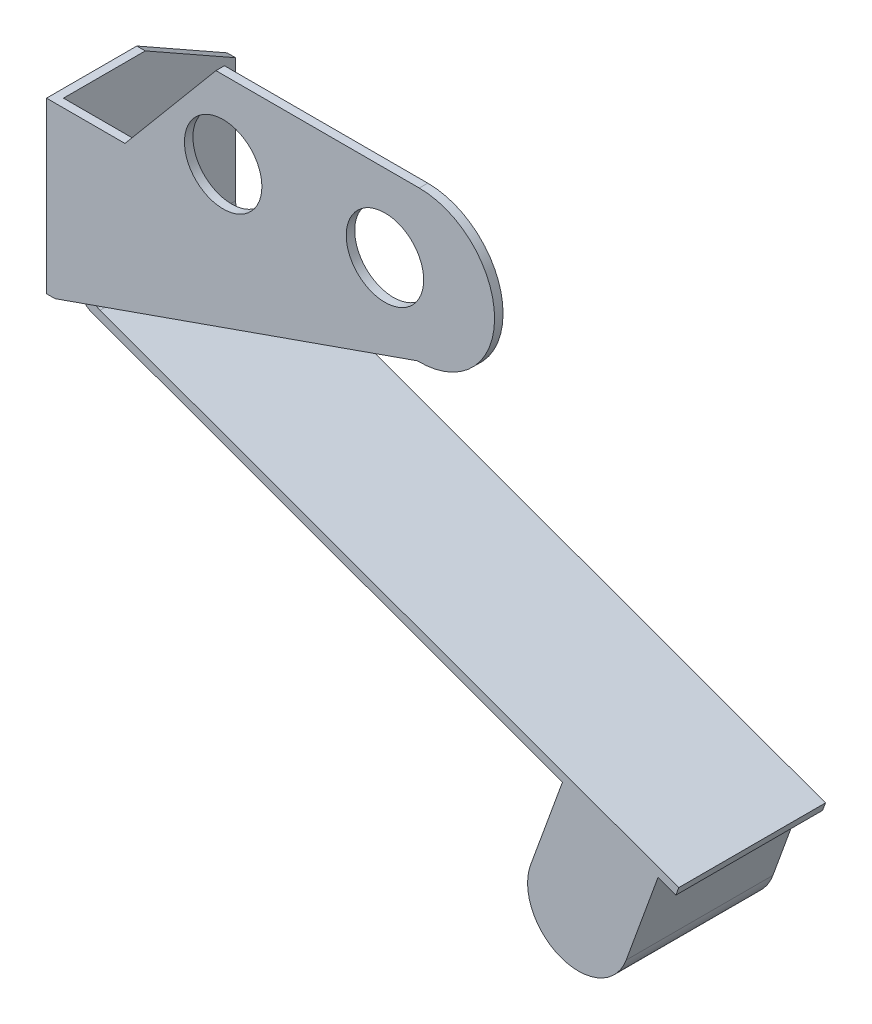
ISO-10303-21;
HEADER;
FILE_DESCRIPTION(('STEP AP214'),'2;1');
FILE_NAME('part.step','',(''),(''),'','','');
FILE_SCHEMA(('AUTOMOTIVE_DESIGN { 1 0 10303 214 1 1 1 1 }'));
ENDSEC;
DATA;
#1=APPLICATION_CONTEXT('core data for automotive mechanical design processes');
#2=APPLICATION_PROTOCOL_DEFINITION('international standard','automotive_design',2000,#1);
#3=PRODUCT_CONTEXT('',#1,'mechanical');
#4=PRODUCT('Part','Part','',(#3));
#5=PRODUCT_RELATED_PRODUCT_CATEGORY('part','',(#4));
#6=PRODUCT_DEFINITION_FORMATION('','',#4);
#7=PRODUCT_DEFINITION_CONTEXT('part definition',#1,'design');
#8=PRODUCT_DEFINITION('design','',#6,#7);
#9=PRODUCT_DEFINITION_SHAPE('','',#8);
#10=(LENGTH_UNIT() NAMED_UNIT(*) SI_UNIT(.MILLI.,.METRE.));
#11=(NAMED_UNIT(*) PLANE_ANGLE_UNIT() SI_UNIT($,.RADIAN.));
#12=(NAMED_UNIT(*) SI_UNIT($,.STERADIAN.) SOLID_ANGLE_UNIT());
#13=UNCERTAINTY_MEASURE_WITH_UNIT(LENGTH_MEASURE(1.E-05),#10,'distance_accuracy_value','');
#14=(GEOMETRIC_REPRESENTATION_CONTEXT(3) GLOBAL_UNCERTAINTY_ASSIGNED_CONTEXT((#13)) GLOBAL_UNIT_ASSIGNED_CONTEXT((#10,
#11,#12)) REPRESENTATION_CONTEXT('',''));
#15=CARTESIAN_POINT('',(0.,0.,0.));
#16=DIRECTION('',(0.,0.,1.));
#17=DIRECTION('',(1.,0.,0.));
#18=AXIS2_PLACEMENT_3D('',#15,#16,#17);
#19=CARTESIAN_POINT('',(-6.41630451818635,0.766619066326838,5.33));
#20=DIRECTION('',(0.766417084251707,-0.642343251670874,0.));
#21=DIRECTION('',(0.642343251670874,0.766417084251707,0.));
#22=AXIS2_PLACEMENT_3D('',#19,#20,#21);
#23=PLANE('',#22);
#24=DIRECTION('',(0.,0.,-1.));
#25=VECTOR('',#24,1.);
#26=CARTESIAN_POINT('',(-3.73172272010136,3.96974971146318,5.33));
#27=LINE('',#26,#25);
#28=CARTESIAN_POINT('',(-3.73172272010136,3.96974971146318,5.33));
#29=VERTEX_POINT('',#28);
#30=CARTESIAN_POINT('',(-3.73172272010136,3.96974971146318,5.08));
#31=VERTEX_POINT('',#30);
#32=EDGE_CURVE('E217',#29,#31,#27,.T.);
#33=ORIENTED_EDGE('',*,*,#32,.T.);
#34=DIRECTION('',(-0.642343251670874,-0.766417084251707,0.));
#35=VECTOR('',#34,1.);
#36=CARTESIAN_POINT('',(-6.41630451818635,0.766619066326838,5.08));
#37=LINE('',#36,#35);
#38=CARTESIAN_POINT('',(-6.41630451818635,0.766619066326838,5.08));
#39=VERTEX_POINT('',#38);
#40=EDGE_CURVE('E342',#31,#39,#37,.T.);
#41=ORIENTED_EDGE('',*,*,#40,.T.);
#42=DIRECTION('',(0.,0.,-1.));
#43=VECTOR('',#42,1.);
#44=CARTESIAN_POINT('',(-6.41630451818635,0.766619066326838,5.33));
#45=LINE('',#44,#43);
#46=CARTESIAN_POINT('',(-6.41630451818635,0.766619066326838,5.33));
#47=VERTEX_POINT('',#46);
#48=EDGE_CURVE('E243',#47,#39,#45,.T.);
#49=ORIENTED_EDGE('',*,*,#48,.F.);
#50=DIRECTION('',(-0.642343251670874,-0.766417084251707,0.));
#51=VECTOR('',#50,1.);
#52=CARTESIAN_POINT('',(-6.41630451818635,0.766619066326838,5.33));
#53=LINE('',#52,#51);
#54=EDGE_CURVE('E216',#29,#47,#53,.T.);
#55=ORIENTED_EDGE('',*,*,#54,.F.);
#56=EDGE_LOOP('',(#33,#41,#49,#55));
#57=FACE_BOUND('',#56,.T.);
#58=ADVANCED_FACE('F32',(#57),#23,.F.);
#59=CARTESIAN_POINT('',(-8.73172272010135,0.766619066326838,5.33));
#60=DIRECTION('',(0.,-1.,0.));
#61=DIRECTION('',(0.,0.,-1.));
#62=AXIS2_PLACEMENT_3D('',#59,#60,#61);
#63=PLANE('',#62);
#64=DIRECTION('',(0.,0.,-1.));
#65=VECTOR('',#64,1.);
#66=CARTESIAN_POINT('',(-8.48172272010135,0.766619066326838,5.33));
#67=LINE('',#66,#65);
#68=CARTESIAN_POINT('',(-8.48172272010135,0.766619066326838,5.08));
#69=VERTEX_POINT('',#68);
#70=CARTESIAN_POINT('',(-8.48172272010135,0.766619066326838,2.665));
#71=VERTEX_POINT('',#70);
#72=EDGE_CURVE('E345',#69,#71,#67,.T.);
#73=ORIENTED_EDGE('',*,*,#72,.T.);
#74=DIRECTION('',(-1.,0.,0.));
#75=VECTOR('',#74,1.);
#76=CARTESIAN_POINT('',(-0.231722720101354,0.766619066326838,2.665));
#77=LINE('',#76,#75);
#78=CARTESIAN_POINT('',(-8.73172272010135,0.766619066326838,2.665));
#79=VERTEX_POINT('',#78);
#80=EDGE_CURVE('E180',#71,#79,#77,.T.);
#81=ORIENTED_EDGE('',*,*,#80,.T.);
#82=DIRECTION('',(0.,0.,-1.));
#83=VECTOR('',#82,1.);
#84=CARTESIAN_POINT('',(-8.73172272010135,0.766619066326838,5.33));
#85=LINE('',#84,#83);
#86=CARTESIAN_POINT('',(-8.73172272010135,0.766619066326838,5.33));
#87=VERTEX_POINT('',#86);
#88=EDGE_CURVE('E179',#87,#79,#85,.T.);
#89=ORIENTED_EDGE('',*,*,#88,.F.);
#90=DIRECTION('',(-1.,0.,0.));
#91=VECTOR('',#90,1.);
#92=CARTESIAN_POINT('',(-8.73172272010135,0.766619066326838,5.33));
#93=LINE('',#92,#91);
#94=EDGE_CURVE('E364',#47,#87,#93,.T.);
#95=ORIENTED_EDGE('',*,*,#94,.F.);
#96=ORIENTED_EDGE('',*,*,#48,.T.);
#97=DIRECTION('',(-1.,0.,0.));
#98=VECTOR('',#97,1.);
#99=CARTESIAN_POINT('',(-8.73172272010135,0.766619066326838,5.08));
#100=LINE('',#99,#98);
#101=EDGE_CURVE('E339',#39,#69,#100,.T.);
#102=ORIENTED_EDGE('',*,*,#101,.T.);
#103=EDGE_LOOP('',(#73,#81,#89,#95,#96,#102));
#104=FACE_BOUND('',#103,.T.);
#105=ADVANCED_FACE('F383',(#104),#63,.F.);
#106=CARTESIAN_POINT('',(-8.73172272010135,-4.92025028853682,5.33));
#107=DIRECTION('',(1.,0.,0.));
#108=DIRECTION('',(0.,0.,-1.));
#109=AXIS2_PLACEMENT_3D('',#106,#107,#108);
#110=PLANE('',#109);
#111=ORIENTED_EDGE('',*,*,#88,.T.);
#112=DIRECTION('',(0.,0.492191601448386,0.870486891034938));
#113=VECTOR('',#112,1.);
#114=CARTESIAN_POINT('',(-8.73172272010135,0.766619066326838,2.665));
#115=LINE('',#114,#113);
#116=CARTESIAN_POINT('',(-8.73172272010135,-0.74022799980239,0.));
#117=VERTEX_POINT('',#116);
#118=EDGE_CURVE('E165',#117,#79,#115,.T.);
#119=ORIENTED_EDGE('',*,*,#118,.F.);
#120=DIRECTION('',(0.,-1.,0.));
#121=VECTOR('',#120,1.);
#122=CARTESIAN_POINT('',(-8.73172272010135,-4.92025028853682,0.));
#123=LINE('',#122,#121);
#124=CARTESIAN_POINT('',(-8.73172272010135,-4.57014651943197,0.));
#125=VERTEX_POINT('',#124);
#126=EDGE_CURVE('E175',#117,#125,#123,.T.);
#127=ORIENTED_EDGE('',*,*,#126,.T.);
#128=DIRECTION('',(0.,0.,-1.));
#129=VECTOR('',#128,1.);
#130=CARTESIAN_POINT('',(-8.73172272010135,-4.57014651943197,5.33));
#131=LINE('',#130,#129);
#132=CARTESIAN_POINT('',(-8.73172272010135,-4.57014651943197,4.33));
#133=VERTEX_POINT('',#132);
#134=EDGE_CURVE('E260',#125,#133,#131,.F.);
#135=ORIENTED_EDGE('',*,*,#134,.T.);
#136=DIRECTION('',(0.,1.,0.));
#137=VECTOR('',#136,1.);
#138=CARTESIAN_POINT('',(-8.73172272010135,-4.92025028853682,4.33));
#139=LINE('',#138,#137);
#140=CARTESIAN_POINT('',(-8.73172272010135,-4.23338093367316,4.33));
#141=VERTEX_POINT('',#140);
#142=EDGE_CURVE('E316',#133,#141,#139,.T.);
#143=ORIENTED_EDGE('',*,*,#142,.T.);
#144=DIRECTION('',(0.,0.,1.));
#145=VECTOR('',#144,1.);
#146=CARTESIAN_POINT('',(-8.73172272010135,-4.23338093367316,5.33));
#147=LINE('',#146,#145);
#148=CARTESIAN_POINT('',(-8.73172272010135,-4.23338093367316,5.33));
#149=VERTEX_POINT('',#148);
#150=EDGE_CURVE('E317',#141,#149,#147,.T.);
#151=ORIENTED_EDGE('',*,*,#150,.T.);
#152=DIRECTION('',(0.,-1.,0.));
#153=VECTOR('',#152,1.);
#154=CARTESIAN_POINT('',(-8.73172272010135,-4.92025028853682,5.33));
#155=LINE('',#154,#153);
#156=EDGE_CURVE('E366',#87,#149,#155,.T.);
#157=ORIENTED_EDGE('',*,*,#156,.F.);
#158=EDGE_LOOP('',(#111,#119,#127,#135,#143,#151,#157));
#159=FACE_BOUND('',#158,.T.);
#160=ADVANCED_FACE('F173',(#159),#110,.F.);
#161=CARTESIAN_POINT('',(5.49593159808687,-10.0986929637863,5.33));
#162=DIRECTION('',(0.342020143325669,0.939692620785908,0.));
#163=DIRECTION('',(-0.939692620785908,0.342020143325669,0.));
#164=AXIS2_PLACEMENT_3D('',#161,#162,#163);
#165=PLANE('',#164);
#166=DIRECTION('',(-0.939692620785908,0.342020143325669,0.));
#167=VECTOR('',#166,1.);
#168=CARTESIAN_POINT('',(5.49593159808687,-10.0986929637863,4.33));
#169=LINE('',#168,#167);
#170=CARTESIAN_POINT('',(5.49593159808687,-10.0986929637863,4.33));
#171=VERTEX_POINT('',#170);
#172=CARTESIAN_POINT('',(-8.40273279176419,-5.03999282982492,4.33));
#173=VERTEX_POINT('',#172);
#174=EDGE_CURVE('E186',#171,#173,#169,.T.);
#175=ORIENTED_EDGE('',*,*,#174,.T.);
#176=DIRECTION('',(0.,0.,-1.));
#177=VECTOR('',#176,1.);
#178=CARTESIAN_POINT('',(-8.40273279176419,-5.03999282982492,5.33));
#179=LINE('',#178,#177);
#180=CARTESIAN_POINT('',(-8.40273279176419,-5.03999282982492,0.));
#181=VERTEX_POINT('',#180);
#182=EDGE_CURVE('E256',#173,#181,#179,.T.);
#183=ORIENTED_EDGE('',*,*,#182,.T.);
#184=DIRECTION('',(0.939692620785908,-0.342020143325669,0.));
#185=VECTOR('',#184,1.);
#186=CARTESIAN_POINT('',(5.49593159808687,-10.0986929637863,0.));
#187=LINE('',#186,#185);
#188=CARTESIAN_POINT('',(5.49593159808687,-10.0986929637863,0.));
#189=VERTEX_POINT('',#188);
#190=EDGE_CURVE('E185',#181,#189,#187,.T.);
#191=ORIENTED_EDGE('',*,*,#190,.T.);
#192=DIRECTION('',(0.,0.,-1.));
#193=VECTOR('',#192,1.);
#194=CARTESIAN_POINT('',(5.49593159808687,-10.0986929637863,5.33));
#195=LINE('',#194,#193);
#196=EDGE_CURVE('E239',#171,#189,#195,.T.);
#197=ORIENTED_EDGE('',*,*,#196,.F.);
#198=EDGE_LOOP('',(#175,#183,#191,#197));
#199=FACE_BOUND('',#198,.T.);
#200=ADVANCED_FACE('F313',(#199),#165,.F.);
#201=CARTESIAN_POINT('',(5.49593159808687,-10.0986929637863,5.33));
#202=DIRECTION('',(0.939692620785908,-0.342020143325669,0.));
#203=DIRECTION('',(0.342020143325669,0.939692620785908,0.));
#204=AXIS2_PLACEMENT_3D('',#201,#202,#203);
#205=PLANE('',#204);
#206=DIRECTION('',(0.,0.,-1.));
#207=VECTOR('',#206,1.);
#208=CARTESIAN_POINT('',(4.55537620394128,-12.6828476709476,5.33));
#209=LINE('',#208,#207);
#210=CARTESIAN_POINT('',(4.55537620394128,-12.6828476709476,4.33));
#211=VERTEX_POINT('',#210);
#212=CARTESIAN_POINT('',(4.55537620394128,-12.6828476709476,0.));
#213=VERTEX_POINT('',#212);
#214=EDGE_CURVE('E237',#211,#213,#209,.T.);
#215=ORIENTED_EDGE('',*,*,#214,.F.);
#216=DIRECTION('',(0.342020143325669,0.939692620785908,0.));
#217=VECTOR('',#216,1.);
#218=CARTESIAN_POINT('',(5.49593159808687,-10.0986929637863,4.33));
#219=LINE('',#218,#217);
#220=EDGE_CURVE('E191',#211,#171,#219,.T.);
#221=ORIENTED_EDGE('',*,*,#220,.T.);
#222=ORIENTED_EDGE('',*,*,#196,.T.);
#223=DIRECTION('',(-0.34202014332567,-0.939692620785908,0.));
#224=VECTOR('',#223,1.);
#225=CARTESIAN_POINT('',(5.49593159808687,-10.0986929637863,0.));
#226=LINE('',#225,#224);
#227=EDGE_CURVE('E188',#189,#213,#226,.T.);
#228=ORIENTED_EDGE('',*,*,#227,.T.);
#229=EDGE_LOOP('',(#215,#221,#222,#228));
#230=FACE_BOUND('',#229,.T.);
#231=ADVANCED_FACE('F309',(#230),#205,.F.);
#232=CARTESIAN_POINT('',(5.96491513512014,-13.1958778859361,5.33));
#233=DIRECTION('',(0.,0.,-1.));
#234=DIRECTION('',(-1.,0.,0.));
#235=AXIS2_PLACEMENT_3D('',#232,#233,#234);
#236=CYLINDRICAL_SURFACE('',#235,1.5);
#237=DIRECTION('',(0.,0.,-1.));
#238=VECTOR('',#237,1.);
#239=CARTESIAN_POINT('',(7.374454066299,-13.7089081009246,5.33));
#240=LINE('',#239,#238);
#241=CARTESIAN_POINT('',(7.374454066299,-13.7089081009246,4.33));
#242=VERTEX_POINT('',#241);
#243=CARTESIAN_POINT('',(7.374454066299,-13.7089081009246,0.));
#244=VERTEX_POINT('',#243);
#245=EDGE_CURVE('E235',#242,#244,#240,.T.);
#246=ORIENTED_EDGE('',*,*,#245,.F.);
#247=CARTESIAN_POINT('',(5.96491513512014,-13.1958778859361,4.33));
#248=DIRECTION('',(0.,0.,-1.));
#249=DIRECTION('',(-1.,0.,0.));
#250=AXIS2_PLACEMENT_3D('',#247,#248,#249);
#251=CIRCLE('',#250,1.5);
#252=EDGE_CURVE('E359',#242,#211,#251,.T.);
#253=ORIENTED_EDGE('',*,*,#252,.T.);
#254=ORIENTED_EDGE('',*,*,#214,.T.);
#255=CARTESIAN_POINT('',(5.96491513512014,-13.1958778859361,0.));
#256=DIRECTION('',(0.,0.,1.));
#257=DIRECTION('',(1.,0.,0.));
#258=AXIS2_PLACEMENT_3D('',#255,#256,#257);
#259=CIRCLE('',#258,1.5);
#260=EDGE_CURVE('E199',#213,#244,#259,.T.);
#261=ORIENTED_EDGE('',*,*,#260,.T.);
#262=EDGE_LOOP('',(#246,#253,#254,#261));
#263=FACE_BOUND('',#262,.T.);
#264=ADVANCED_FACE('F305',(#263),#236,.T.);
#265=CARTESIAN_POINT('',(7.374454066299,-13.7089081009246,5.33));
#266=DIRECTION('',(-0.939692620785908,0.34202014332567,0.));
#267=DIRECTION('',(-0.34202014332567,-0.939692620785908,0.));
#268=AXIS2_PLACEMENT_3D('',#265,#266,#267);
#269=PLANE('',#268);
#270=DIRECTION('',(0.,0.,-1.));
#271=VECTOR('',#270,1.);
#272=CARTESIAN_POINT('',(8.3150094604446,-11.1247533937634,5.33));
#273=LINE('',#272,#271);
#274=CARTESIAN_POINT('',(8.3150094604446,-11.1247533937634,4.33));
#275=VERTEX_POINT('',#274);
#276=CARTESIAN_POINT('',(8.3150094604446,-11.1247533937634,0.));
#277=VERTEX_POINT('',#276);
#278=EDGE_CURVE('E233',#275,#277,#273,.T.);
#279=ORIENTED_EDGE('',*,*,#278,.F.);
#280=DIRECTION('',(-0.34202014332567,-0.939692620785908,0.));
#281=VECTOR('',#280,1.);
#282=CARTESIAN_POINT('',(7.374454066299,-13.7089081009246,4.33));
#283=LINE('',#282,#281);
#284=EDGE_CURVE('E302',#275,#242,#283,.T.);
#285=ORIENTED_EDGE('',*,*,#284,.T.);
#286=ORIENTED_EDGE('',*,*,#245,.T.);
#287=DIRECTION('',(0.34202014332567,0.939692620785908,0.));
#288=VECTOR('',#287,1.);
#289=CARTESIAN_POINT('',(7.374454066299,-13.7089081009246,0.));
#290=LINE('',#289,#288);
#291=EDGE_CURVE('E202',#244,#277,#290,.T.);
#292=ORIENTED_EDGE('',*,*,#291,.T.);
#293=EDGE_LOOP('',(#279,#285,#286,#292));
#294=FACE_BOUND('',#293,.T.);
#295=ADVANCED_FACE('F300',(#294),#269,.F.);
#296=CARTESIAN_POINT('',(8.84052928859513,-11.3160269687268,5.33));
#297=DIRECTION('',(0.342020143325665,0.93969262078591,0.));
#298=DIRECTION('',(-0.93969262078591,0.342020143325665,0.));
#299=AXIS2_PLACEMENT_3D('',#296,#297,#298);
#300=PLANE('',#299);
#301=DIRECTION('',(0.,0.,-1.));
#302=VECTOR('',#301,1.);
#303=CARTESIAN_POINT('',(8.84052928859513,-11.3160269687268,5.33));
#304=LINE('',#303,#302);
#305=CARTESIAN_POINT('',(8.84052928859513,-11.3160269687268,4.33));
#306=VERTEX_POINT('',#305);
#307=CARTESIAN_POINT('',(8.84052928859513,-11.3160269687268,0.));
#308=VERTEX_POINT('',#307);
#309=EDGE_CURVE('E231',#306,#308,#304,.T.);
#310=ORIENTED_EDGE('',*,*,#309,.F.);
#311=DIRECTION('',(-0.93969262078591,0.342020143325665,0.));
#312=VECTOR('',#311,1.);
#313=CARTESIAN_POINT('',(8.84052928859513,-11.3160269687268,4.33));
#314=LINE('',#313,#312);
#315=EDGE_CURVE('E297',#306,#275,#314,.T.);
#316=ORIENTED_EDGE('',*,*,#315,.T.);
#317=ORIENTED_EDGE('',*,*,#278,.T.);
#318=DIRECTION('',(0.93969262078591,-0.342020143325665,0.));
#319=VECTOR('',#318,1.);
#320=CARTESIAN_POINT('',(8.84052928859513,-11.3160269687268,0.));
#321=LINE('',#320,#319);
#322=EDGE_CURVE('E205',#277,#308,#321,.T.);
#323=ORIENTED_EDGE('',*,*,#322,.T.);
#324=EDGE_LOOP('',(#310,#316,#317,#323));
#325=FACE_BOUND('',#324,.T.);
#326=ADVANCED_FACE('F294',(#325),#300,.F.);
#327=CARTESIAN_POINT('',(8.92603432442654,-11.0811038135304,5.33));
#328=DIRECTION('',(-0.939692620785906,0.342020143325676,0.));
#329=DIRECTION('',(-0.342020143325676,-0.939692620785906,0.));
#330=AXIS2_PLACEMENT_3D('',#327,#328,#329);
#331=PLANE('',#330);
#332=DIRECTION('',(0.,0.,-1.));
#333=VECTOR('',#332,1.);
#334=CARTESIAN_POINT('',(8.92603432442654,-11.0811038135304,5.33));
#335=LINE('',#334,#333);
#336=CARTESIAN_POINT('',(8.92603432442655,-11.0811038135304,4.33));
#337=VERTEX_POINT('',#336);
#338=CARTESIAN_POINT('',(8.92603432442654,-11.0811038135304,0.));
#339=VERTEX_POINT('',#338);
#340=EDGE_CURVE('E229',#337,#339,#335,.T.);
#341=ORIENTED_EDGE('',*,*,#340,.F.);
#342=DIRECTION('',(0.342020143325669,0.939692620785908,0.));
#343=VECTOR('',#342,1.);
#344=CARTESIAN_POINT('',(6.18987317782119,-18.5986447798176,4.33));
#345=LINE('',#344,#343);
#346=EDGE_CURVE('E355',#306,#337,#345,.T.);
#347=ORIENTED_EDGE('',*,*,#346,.F.);
#348=ORIENTED_EDGE('',*,*,#309,.T.);
#349=DIRECTION('',(0.342020143325676,0.939692620785906,0.));
#350=VECTOR('',#349,1.);
#351=CARTESIAN_POINT('',(8.92603432442654,-11.0811038135304,0.));
#352=LINE('',#351,#350);
#353=EDGE_CURVE('E208',#308,#339,#352,.T.);
#354=ORIENTED_EDGE('',*,*,#353,.T.);
#355=EDGE_LOOP('',(#341,#347,#348,#354));
#356=FACE_BOUND('',#355,.T.);
#357=ADVANCED_FACE('F288',(#356),#331,.F.);
#358=CARTESIAN_POINT('',(-8.48172272010135,-4.74519840398439,5.33));
#359=DIRECTION('',(-0.342020143325669,-0.939692620785908,0.));
#360=DIRECTION('',(0.939692620785908,-0.342020143325669,0.));
#361=AXIS2_PLACEMENT_3D('',#358,#359,#360);
#362=PLANE('',#361);
#363=DIRECTION('',(-0.939692620785908,0.342020143325669,0.));
#364=VECTOR('',#363,1.);
#365=CARTESIAN_POINT('',(-8.48172272010135,-4.74519840398439,0.));
#366=LINE('',#365,#364);
#367=CARTESIAN_POINT('',(-8.15273279176419,-4.86494094527249,0.));
#368=VERTEX_POINT('',#367);
#369=EDGE_CURVE('E211',#339,#368,#366,.T.);
#370=ORIENTED_EDGE('',*,*,#369,.T.);
#371=DIRECTION('',(0.,0.,-1.));
#372=VECTOR('',#371,1.);
#373=CARTESIAN_POINT('',(-8.15273279176419,-4.86494094527249,4.33));
#374=LINE('',#373,#372);
#375=CARTESIAN_POINT('',(-8.15273279176419,-4.86494094527249,4.33));
#376=VERTEX_POINT('',#375);
#377=EDGE_CURVE('E254',#368,#376,#374,.F.);
#378=ORIENTED_EDGE('',*,*,#377,.T.);
#379=DIRECTION('',(-0.939692620785908,0.342020143325669,0.));
#380=VECTOR('',#379,1.);
#381=CARTESIAN_POINT('',(8.92603432442655,-11.0811038135304,4.33));
#382=LINE('',#381,#380);
#383=EDGE_CURVE('E275',#337,#376,#382,.T.);
#384=ORIENTED_EDGE('',*,*,#383,.F.);
#385=ORIENTED_EDGE('',*,*,#340,.T.);
#386=EDGE_LOOP('',(#370,#378,#384,#385));
#387=FACE_BOUND('',#386,.T.);
#388=ADVANCED_FACE('F284',(#387),#362,.F.);
#389=CARTESIAN_POINT('',(-8.48172272010135,-4.23338093367316,5.33));
#390=DIRECTION('',(-1.,0.,0.));
#391=DIRECTION('',(0.,0.,1.));
#392=AXIS2_PLACEMENT_3D('',#389,#390,#391);
#393=PLANE('',#392);
#394=DIRECTION('',(0.,1.,0.));
#395=VECTOR('',#394,1.);
#396=CARTESIAN_POINT('',(-8.48172272010135,-4.23338093367316,0.));
#397=LINE('',#396,#395);
#398=CARTESIAN_POINT('',(-8.48172272010135,-4.39509463487954,0.));
#399=VERTEX_POINT('',#398);
#400=CARTESIAN_POINT('',(-8.48172272010135,-0.740227999802391,0.));
#401=VERTEX_POINT('',#400);
#402=EDGE_CURVE('E214',#399,#401,#397,.T.);
#403=ORIENTED_EDGE('',*,*,#402,.T.);
#404=DIRECTION('',(0.,0.492191601448386,0.870486891034938));
#405=VECTOR('',#404,1.);
#406=CARTESIAN_POINT('',(-8.48172272010135,0.697165691585806,2.54216520949912));
#407=LINE('',#406,#405);
#408=EDGE_CURVE('E46',#401,#71,#407,.T.);
#409=ORIENTED_EDGE('',*,*,#408,.T.);
#410=ORIENTED_EDGE('',*,*,#72,.F.);
#411=DIRECTION('',(0.,1.,0.));
#412=VECTOR('',#411,1.);
#413=CARTESIAN_POINT('',(-8.48172272010135,-4.53025028853682,5.08));
#414=LINE('',#413,#412);
#415=CARTESIAN_POINT('',(-8.48172272010135,-4.23338093367316,5.08));
#416=VERTEX_POINT('',#415);
#417=EDGE_CURVE('E251',#416,#69,#414,.T.);
#418=ORIENTED_EDGE('',*,*,#417,.F.);
#419=DIRECTION('',(0.,0.,1.));
#420=VECTOR('',#419,1.);
#421=CARTESIAN_POINT('',(-8.48172272010135,-4.23338093367316,5.33));
#422=LINE('',#421,#420);
#423=CARTESIAN_POINT('',(-8.48172272010135,-4.23338093367316,4.33));
#424=VERTEX_POINT('',#423);
#425=EDGE_CURVE('E395',#424,#416,#422,.T.);
#426=ORIENTED_EDGE('',*,*,#425,.F.);
#427=DIRECTION('',(0.,1.,0.));
#428=VECTOR('',#427,1.);
#429=CARTESIAN_POINT('',(-8.48172272010135,-4.23338093367316,4.33));
#430=LINE('',#429,#428);
#431=CARTESIAN_POINT('',(-8.48172272010135,-4.39509463487954,4.33));
#432=VERTEX_POINT('',#431);
#433=EDGE_CURVE('E272',#432,#424,#430,.T.);
#434=ORIENTED_EDGE('',*,*,#433,.F.);
#435=DIRECTION('',(0.,0.,-1.));
#436=VECTOR('',#435,1.);
#437=CARTESIAN_POINT('',(-8.48172272010135,-4.39509463487954,0.));
#438=LINE('',#437,#436);
#439=EDGE_CURVE('E246',#432,#399,#438,.T.);
#440=ORIENTED_EDGE('',*,*,#439,.T.);
#441=EDGE_LOOP('',(#403,#409,#410,#418,#426,#434,#440));
#442=FACE_BOUND('',#441,.T.);
#443=ADVANCED_FACE('F280',(#442),#393,.F.);
#444=CARTESIAN_POINT('',(2.21260795735433,-0.474901672675676,5.33));
#445=DIRECTION('',(-0.331565438912642,0.943432223171685,0.));
#446=DIRECTION('',(-0.943432223171685,-0.331565438912642,0.));
#447=AXIS2_PLACEMENT_3D('',#444,#445,#446);
#448=PLANE('',#447);
#449=DIRECTION('',(0.,0.,-1.));
#450=VECTOR('',#449,1.);
#451=CARTESIAN_POINT('',(-8.48172272010135,-4.23338093367316,5.33));
#452=LINE('',#451,#450);
#453=CARTESIAN_POINT('',(-8.48172272010135,-4.23338093367316,5.33));
#454=VERTEX_POINT('',#453);
#455=EDGE_CURVE('E226',#454,#416,#452,.T.);
#456=ORIENTED_EDGE('',*,*,#455,.T.);
#457=DIRECTION('',(0.943432223171685,0.331565438912642,0.));
#458=VECTOR('',#457,1.);
#459=CARTESIAN_POINT('',(2.21260795735433,-0.474901672675676,5.08));
#460=LINE('',#459,#458);
#461=CARTESIAN_POINT('',(2.21260795735433,-0.474901672675675,5.08));
#462=VERTEX_POINT('',#461);
#463=EDGE_CURVE('E336',#416,#462,#460,.T.);
#464=ORIENTED_EDGE('',*,*,#463,.T.);
#465=DIRECTION('',(0.,0.,-1.));
#466=VECTOR('',#465,1.);
#467=CARTESIAN_POINT('',(2.21260795735433,-0.474901672675676,5.33));
#468=LINE('',#467,#466);
#469=CARTESIAN_POINT('',(2.21260795735433,-0.474901672675676,5.33));
#470=VERTEX_POINT('',#469);
#471=EDGE_CURVE('E223',#470,#462,#468,.T.);
#472=ORIENTED_EDGE('',*,*,#471,.F.);
#473=DIRECTION('',(0.943432223171684,0.331565438912642,0.));
#474=VECTOR('',#473,1.);
#475=CARTESIAN_POINT('',(2.21260795735433,-0.474901672675676,5.33));
#476=LINE('',#475,#474);
#477=EDGE_CURVE('E368',#454,#470,#476,.T.);
#478=ORIENTED_EDGE('',*,*,#477,.F.);
#479=EDGE_LOOP('',(#456,#464,#472,#478));
#480=FACE_BOUND('',#479,.T.);
#481=ADVANCED_FACE('F388',(#480),#448,.F.);
#482=CARTESIAN_POINT('',(2.26827727989864,1.74707538986078,5.33));
#483=DIRECTION('',(0.,0.,-1.));
#484=DIRECTION('',(-1.,0.,0.));
#485=AXIS2_PLACEMENT_3D('',#482,#483,#484);
#486=CYLINDRICAL_SURFACE('',#485,2.2226743216024);
#487=ORIENTED_EDGE('',*,*,#471,.T.);
#488=CARTESIAN_POINT('',(2.26827727989864,1.74707538986078,5.08));
#489=DIRECTION('',(0.,0.,1.));
#490=DIRECTION('',(1.,0.,0.));
#491=AXIS2_PLACEMENT_3D('',#488,#489,#490);
#492=CIRCLE('',#491,2.2226743216024);
#493=CARTESIAN_POINT('',(2.26827727989865,3.96974971146318,5.08));
#494=VERTEX_POINT('',#493);
#495=EDGE_CURVE('E333',#462,#494,#492,.T.);
#496=ORIENTED_EDGE('',*,*,#495,.T.);
#497=DIRECTION('',(0.,0.,-1.));
#498=VECTOR('',#497,1.);
#499=CARTESIAN_POINT('',(2.26827727989864,3.96974971146318,5.33));
#500=LINE('',#499,#498);
#501=CARTESIAN_POINT('',(2.26827727989864,3.96974971146318,5.33));
#502=VERTEX_POINT('',#501);
#503=EDGE_CURVE('E220',#502,#494,#500,.T.);
#504=ORIENTED_EDGE('',*,*,#503,.F.);
#505=CARTESIAN_POINT('',(2.26827727989864,1.74707538986078,5.33));
#506=DIRECTION('',(0.,0.,1.));
#507=DIRECTION('',(-1.,0.,0.));
#508=AXIS2_PLACEMENT_3D('',#505,#506,#507);
#509=CIRCLE('',#508,2.2226743216024);
#510=EDGE_CURVE('E369',#470,#502,#509,.T.);
#511=ORIENTED_EDGE('',*,*,#510,.F.);
#512=EDGE_LOOP('',(#487,#496,#504,#511));
#513=FACE_BOUND('',#512,.T.);
#514=ADVANCED_FACE('F391',(#513),#486,.T.);
#515=CARTESIAN_POINT('',(-3.73172272010136,3.96974971146318,5.33));
#516=DIRECTION('',(0.,-1.,0.));
#517=DIRECTION('',(0.,0.,-1.));
#518=AXIS2_PLACEMENT_3D('',#515,#516,#517);
#519=PLANE('',#518);
#520=ORIENTED_EDGE('',*,*,#503,.T.);
#521=DIRECTION('',(1.,0.,0.));
#522=VECTOR('',#521,1.);
#523=CARTESIAN_POINT('',(-8.48172272010135,3.96974971146318,5.08));
#524=LINE('',#523,#522);
#525=EDGE_CURVE('E321',#31,#494,#524,.T.);
#526=ORIENTED_EDGE('',*,*,#525,.F.);
#527=ORIENTED_EDGE('',*,*,#32,.F.);
#528=DIRECTION('',(-1.,0.,0.));
#529=VECTOR('',#528,1.);
#530=CARTESIAN_POINT('',(-3.73172272010136,3.96974971146318,5.33));
#531=LINE('',#530,#529);
#532=EDGE_CURVE('E194',#502,#29,#531,.T.);
#533=ORIENTED_EDGE('',*,*,#532,.F.);
#534=EDGE_LOOP('',(#520,#526,#527,#533));
#535=FACE_BOUND('',#534,.T.);
#536=ADVANCED_FACE('F380',(#535),#519,.F.);
#537=CARTESIAN_POINT('',(2.26827727989864,1.74707538986078,5.33));
#538=DIRECTION('',(0.,0.,-1.));
#539=DIRECTION('',(-1.,0.,0.));
#540=AXIS2_PLACEMENT_3D('',#537,#538,#539);
#541=PLANE('',#540);
#542=CARTESIAN_POINT('',(1.25587727989865,1.68374971146318,5.33));
#543=DIRECTION('',(0.,0.,1.));
#544=DIRECTION('',(1.,0.,0.));
#545=AXIS2_PLACEMENT_3D('',#542,#543,#544);
#546=CIRCLE('',#545,1.143);
#547=CARTESIAN_POINT('',(2.39887727989865,1.68374971146318,5.33));
#548=VERTEX_POINT('',#547);
#549=EDGE_CURVE('E348',#548,#548,#546,.T.);
#550=ORIENTED_EDGE('',*,*,#549,.F.);
#551=EDGE_LOOP('',(#550));
#552=FACE_BOUND('',#551,.T.);
#553=CARTESIAN_POINT('',(-3.51932272010135,1.68374971146318,5.33));
#554=DIRECTION('',(0.,0.,1.));
#555=DIRECTION('',(1.,0.,0.));
#556=AXIS2_PLACEMENT_3D('',#553,#554,#555);
#557=CIRCLE('',#556,1.143);
#558=CARTESIAN_POINT('',(-2.37632272010135,1.68374971146318,5.33));
#559=VERTEX_POINT('',#558);
#560=EDGE_CURVE('E351',#559,#559,#557,.T.);
#561=ORIENTED_EDGE('',*,*,#560,.F.);
#562=EDGE_LOOP('',(#561));
#563=FACE_BOUND('',#562,.T.);
#564=ORIENTED_EDGE('',*,*,#156,.T.);
#565=DIRECTION('',(1.,0.,0.));
#566=VECTOR('',#565,1.);
#567=CARTESIAN_POINT('',(-16.9817227201014,-4.23338093367316,5.33));
#568=LINE('',#567,#566);
#569=EDGE_CURVE('E319',#149,#454,#568,.T.);
#570=ORIENTED_EDGE('',*,*,#569,.T.);
#571=ORIENTED_EDGE('',*,*,#477,.T.);
#572=ORIENTED_EDGE('',*,*,#510,.T.);
#573=ORIENTED_EDGE('',*,*,#532,.T.);
#574=ORIENTED_EDGE('',*,*,#54,.T.);
#575=ORIENTED_EDGE('',*,*,#94,.T.);
#576=EDGE_LOOP('',(#564,#570,#571,#572,#573,#574,#575));
#577=FACE_BOUND('',#576,.T.);
#578=ADVANCED_FACE('F375',(#552,#563,#577),#541,.F.);
#579=CARTESIAN_POINT('',(2.26827727989864,1.74707538986078,0.));
#580=DIRECTION('',(0.,0.,-1.));
#581=DIRECTION('',(-1.,0.,0.));
#582=AXIS2_PLACEMENT_3D('',#579,#580,#581);
#583=PLANE('',#582);
#584=DIRECTION('',(-1.,0.,0.));
#585=VECTOR('',#584,1.);
#586=CARTESIAN_POINT('',(2.26827727989864,-0.74022799980239,0.));
#587=LINE('',#586,#585);
#588=EDGE_CURVE('E11',#401,#117,#587,.T.);
#589=ORIENTED_EDGE('',*,*,#588,.F.);
#590=ORIENTED_EDGE('',*,*,#402,.F.);
#591=CARTESIAN_POINT('',(-7.98172272010135,-4.39509463487954,0.));
#592=DIRECTION('',(0.,0.,-1.));
#593=DIRECTION('',(-1.,0.,0.));
#594=AXIS2_PLACEMENT_3D('',#591,#592,#593);
#595=CIRCLE('',#594,0.5);
#596=EDGE_CURVE('E263',#399,#368,#595,.F.);
#597=ORIENTED_EDGE('',*,*,#596,.T.);
#598=ORIENTED_EDGE('',*,*,#369,.F.);
#599=ORIENTED_EDGE('',*,*,#353,.F.);
#600=ORIENTED_EDGE('',*,*,#322,.F.);
#601=ORIENTED_EDGE('',*,*,#291,.F.);
#602=ORIENTED_EDGE('',*,*,#260,.F.);
#603=ORIENTED_EDGE('',*,*,#227,.F.);
#604=ORIENTED_EDGE('',*,*,#190,.F.);
#605=CARTESIAN_POINT('',(-8.23172272010135,-4.57014651943197,0.));
#606=DIRECTION('',(0.,0.,-1.));
#607=DIRECTION('',(-1.,0.,0.));
#608=AXIS2_PLACEMENT_3D('',#605,#606,#607);
#609=CIRCLE('',#608,0.5);
#610=EDGE_CURVE('E184',#181,#125,#609,.T.);
#611=ORIENTED_EDGE('',*,*,#610,.T.);
#612=ORIENTED_EDGE('',*,*,#126,.F.);
#613=EDGE_LOOP('',(#589,#590,#597,#598,#599,#600,#601,#602,#603,#604,#611,#612));
#614=FACE_BOUND('',#613,.T.);
#615=ADVANCED_FACE('F182',(#614),#583,.T.);
#616=CARTESIAN_POINT('',(6.18987317782119,-18.5986447798176,4.33));
#617=DIRECTION('',(0.,0.,-1.));
#618=DIRECTION('',(-1.,0.,0.));
#619=AXIS2_PLACEMENT_3D('',#616,#617,#618);
#620=PLANE('',#619);
#621=CARTESIAN_POINT('',(-7.98172272010135,-4.39509463487954,4.33));
#622=DIRECTION('',(0.,0.,-1.));
#623=DIRECTION('',(-1.,0.,0.));
#624=AXIS2_PLACEMENT_3D('',#621,#622,#623);
#625=CIRCLE('',#624,0.5);
#626=EDGE_CURVE('E40',#376,#432,#625,.T.);
#627=ORIENTED_EDGE('',*,*,#626,.T.);
#628=ORIENTED_EDGE('',*,*,#433,.T.);
#629=DIRECTION('',(1.,0.,0.));
#630=VECTOR('',#629,1.);
#631=CARTESIAN_POINT('',(-16.9817227201014,-4.23338093367316,4.33));
#632=LINE('',#631,#630);
#633=EDGE_CURVE('E324',#141,#424,#632,.T.);
#634=ORIENTED_EDGE('',*,*,#633,.F.);
#635=ORIENTED_EDGE('',*,*,#142,.F.);
#636=CARTESIAN_POINT('',(-8.23172272010135,-4.57014651943197,4.33));
#637=DIRECTION('',(0.,0.,-1.));
#638=DIRECTION('',(-1.,0.,0.));
#639=AXIS2_PLACEMENT_3D('',#636,#637,#638);
#640=CIRCLE('',#639,0.5);
#641=EDGE_CURVE('E54',#133,#173,#640,.F.);
#642=ORIENTED_EDGE('',*,*,#641,.T.);
#643=ORIENTED_EDGE('',*,*,#174,.F.);
#644=ORIENTED_EDGE('',*,*,#220,.F.);
#645=ORIENTED_EDGE('',*,*,#252,.F.);
#646=ORIENTED_EDGE('',*,*,#284,.F.);
#647=ORIENTED_EDGE('',*,*,#315,.F.);
#648=ORIENTED_EDGE('',*,*,#346,.T.);
#649=ORIENTED_EDGE('',*,*,#383,.T.);
#650=EDGE_LOOP('',(#627,#628,#634,#635,#642,#643,#644,#645,#646,#647,#648,#649));
#651=FACE_BOUND('',#650,.T.);
#652=ADVANCED_FACE('F270',(#651),#620,.F.);
#653=CARTESIAN_POINT('',(-3.51932272010135,1.68374971146318,-2.67));
#654=DIRECTION('',(0.,0.,1.));
#655=DIRECTION('',(1.,0.,0.));
#656=AXIS2_PLACEMENT_3D('',#653,#654,#655);
#657=CYLINDRICAL_SURFACE('',#656,1.143);
#658=CARTESIAN_POINT('',(-3.51932272010135,1.68374971146318,5.08));
#659=DIRECTION('',(0.,0.,1.));
#660=DIRECTION('',(1.,0.,0.));
#661=AXIS2_PLACEMENT_3D('',#658,#659,#660);
#662=CIRCLE('',#661,1.143);
#663=CARTESIAN_POINT('',(-2.37632272010135,1.68374971146318,5.08));
#664=VERTEX_POINT('',#663);
#665=EDGE_CURVE('E250',#664,#664,#662,.F.);
#666=ORIENTED_EDGE('',*,*,#665,.T.);
#667=EDGE_LOOP('',(#666));
#668=FACE_BOUND('',#667,.T.);
#669=ORIENTED_EDGE('',*,*,#560,.T.);
#670=EDGE_LOOP('',(#669));
#671=FACE_BOUND('',#670,.T.);
#672=ADVANCED_FACE('F425',(#668,#671),#657,.F.);
#673=CARTESIAN_POINT('',(1.25587727989865,1.68374971146318,-2.67));
#674=DIRECTION('',(0.,0.,1.));
#675=DIRECTION('',(1.,0.,0.));
#676=AXIS2_PLACEMENT_3D('',#673,#674,#675);
#677=CYLINDRICAL_SURFACE('',#676,1.143);
#678=CARTESIAN_POINT('',(1.25587727989865,1.68374971146318,5.08));
#679=DIRECTION('',(0.,0.,1.));
#680=DIRECTION('',(1.,0.,0.));
#681=AXIS2_PLACEMENT_3D('',#678,#679,#680);
#682=CIRCLE('',#681,1.143);
#683=CARTESIAN_POINT('',(2.39887727989865,1.68374971146318,5.08));
#684=VERTEX_POINT('',#683);
#685=EDGE_CURVE('E247',#684,#684,#682,.F.);
#686=ORIENTED_EDGE('',*,*,#685,.T.);
#687=EDGE_LOOP('',(#686));
#688=FACE_BOUND('',#687,.T.);
#689=ORIENTED_EDGE('',*,*,#549,.T.);
#690=EDGE_LOOP('',(#689));
#691=FACE_BOUND('',#690,.T.);
#692=ADVANCED_FACE('F420',(#688,#691),#677,.F.);
#693=CARTESIAN_POINT('',(-8.48172272010135,-4.53025028853682,5.08));
#694=DIRECTION('',(0.,0.,1.));
#695=DIRECTION('',(1.,0.,0.));
#696=AXIS2_PLACEMENT_3D('',#693,#694,#695);
#697=PLANE('',#696);
#698=ORIENTED_EDGE('',*,*,#685,.F.);
#699=EDGE_LOOP('',(#698));
#700=FACE_BOUND('',#699,.T.);
#701=ORIENTED_EDGE('',*,*,#665,.F.);
#702=EDGE_LOOP('',(#701));
#703=FACE_BOUND('',#702,.T.);
#704=ORIENTED_EDGE('',*,*,#525,.T.);
#705=ORIENTED_EDGE('',*,*,#495,.F.);
#706=ORIENTED_EDGE('',*,*,#463,.F.);
#707=ORIENTED_EDGE('',*,*,#417,.T.);
#708=ORIENTED_EDGE('',*,*,#101,.F.);
#709=ORIENTED_EDGE('',*,*,#40,.F.);
#710=EDGE_LOOP('',(#704,#705,#706,#707,#708,#709));
#711=FACE_BOUND('',#710,.T.);
#712=ADVANCED_FACE('F393',(#700,#703,#711),#697,.F.);
#713=CARTESIAN_POINT('',(-7.98172272010135,-4.39509463487954,5.33));
#714=DIRECTION('',(0.,0.,1.));
#715=DIRECTION('',(1.,0.,0.));
#716=AXIS2_PLACEMENT_3D('',#713,#714,#715);
#717=CYLINDRICAL_SURFACE('',#716,0.5);
#718=ORIENTED_EDGE('',*,*,#626,.F.);
#719=ORIENTED_EDGE('',*,*,#377,.F.);
#720=ORIENTED_EDGE('',*,*,#596,.F.);
#721=ORIENTED_EDGE('',*,*,#439,.F.);
#722=EDGE_LOOP('',(#718,#719,#720,#721));
#723=FACE_BOUND('',#722,.T.);
#724=ADVANCED_FACE('F278',(#723),#717,.F.);
#725=CARTESIAN_POINT('',(-8.23172272010135,-4.57014651943197,5.33));
#726=DIRECTION('',(0.,0.,-1.));
#727=DIRECTION('',(-1.,0.,0.));
#728=AXIS2_PLACEMENT_3D('',#725,#726,#727);
#729=CYLINDRICAL_SURFACE('',#728,0.5);
#730=ORIENTED_EDGE('',*,*,#641,.F.);
#731=ORIENTED_EDGE('',*,*,#134,.F.);
#732=ORIENTED_EDGE('',*,*,#610,.F.);
#733=ORIENTED_EDGE('',*,*,#182,.F.);
#734=EDGE_LOOP('',(#730,#731,#732,#733));
#735=FACE_BOUND('',#734,.T.);
#736=ADVANCED_FACE('F34',(#735),#729,.T.);
#737=CARTESIAN_POINT('',(-16.9817227201014,-4.23338093367316,5.33));
#738=DIRECTION('',(0.,1.,0.));
#739=DIRECTION('',(0.,0.,1.));
#740=AXIS2_PLACEMENT_3D('',#737,#738,#739);
#741=PLANE('',#740);
#742=ORIENTED_EDGE('',*,*,#633,.T.);
#743=ORIENTED_EDGE('',*,*,#425,.T.);
#744=ORIENTED_EDGE('',*,*,#455,.F.);
#745=ORIENTED_EDGE('',*,*,#569,.F.);
#746=ORIENTED_EDGE('',*,*,#150,.F.);
#747=EDGE_LOOP('',(#742,#743,#744,#745,#746));
#748=FACE_BOUND('',#747,.T.);
#749=ADVANCED_FACE('F400',(#748),#741,.F.);
#750=CARTESIAN_POINT('',(-0.231722720101354,0.766619066326838,2.665));
#751=DIRECTION('',(0.,-0.870486891034938,0.492191601448386));
#752=DIRECTION('',(0.,-0.492191601448386,-0.870486891034938));
#753=AXIS2_PLACEMENT_3D('',#750,#751,#752);
#754=PLANE('',#753);
#755=ORIENTED_EDGE('',*,*,#588,.T.);
#756=ORIENTED_EDGE('',*,*,#118,.T.);
#757=ORIENTED_EDGE('',*,*,#80,.F.);
#758=ORIENTED_EDGE('',*,*,#408,.F.);
#759=EDGE_LOOP('',(#755,#756,#757,#758));
#760=FACE_BOUND('',#759,.T.);
#761=ADVANCED_FACE('F164',(#760),#754,.F.);
#762=CLOSED_SHELL('',(#58,#105,#160,#200,#231,#264,#295,#326,#357,#388,#443,#481,#514,#536,#578,
#615,#652,#672,#692,#712,#724,#736,#749,#761));
#763=MANIFOLD_SOLID_BREP('B2',#762);
#764=ADVANCED_BREP_SHAPE_REPRESENTATION('',(#18,#763),#14);
#765=SHAPE_DEFINITION_REPRESENTATION(#9,#764);
ENDSEC;
END-ISO-10303-21;
